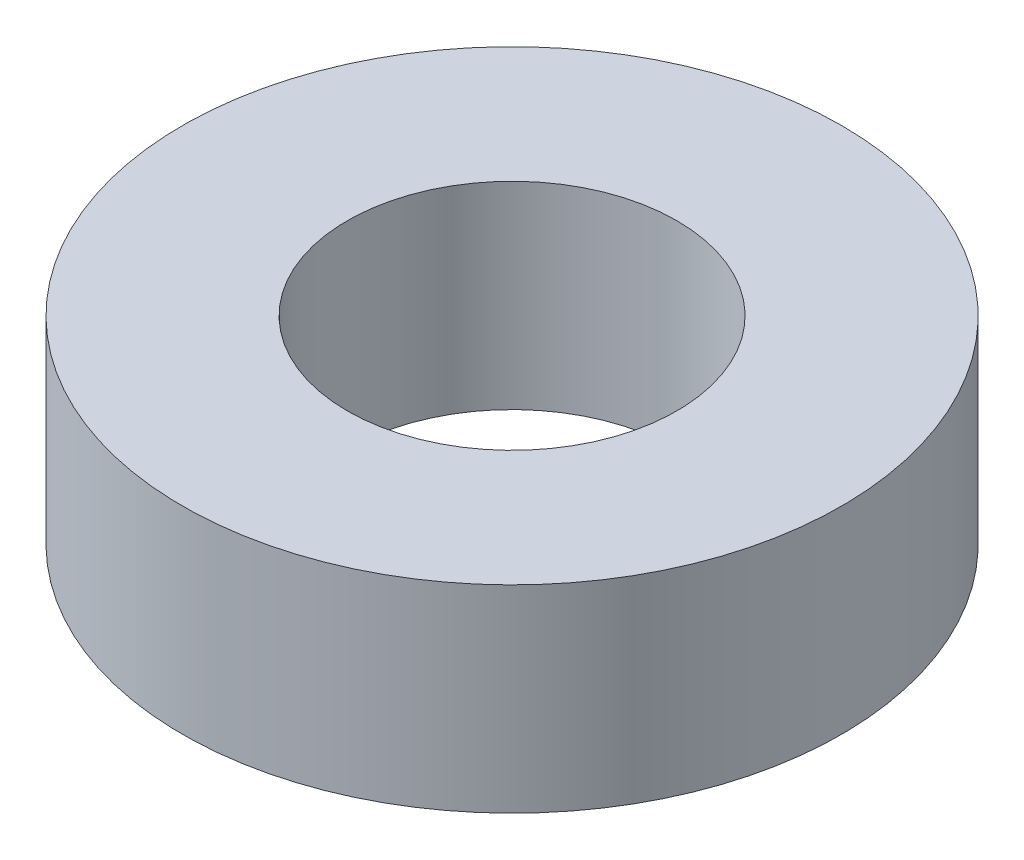
ISO-10303-21;
HEADER;
FILE_DESCRIPTION(('STEP AP214'),'2;1');
FILE_NAME('part.step','',(''),(''),'','','');
FILE_SCHEMA(('AUTOMOTIVE_DESIGN { 1 0 10303 214 1 1 1 1 }'));
ENDSEC;
DATA;
#1=APPLICATION_CONTEXT('core data for automotive mechanical design processes');
#2=APPLICATION_PROTOCOL_DEFINITION('international standard','automotive_design',2000,#1);
#3=PRODUCT_CONTEXT('',#1,'mechanical');
#4=PRODUCT('Part','Part','',(#3));
#5=PRODUCT_RELATED_PRODUCT_CATEGORY('part','',(#4));
#6=PRODUCT_DEFINITION_FORMATION('','',#4);
#7=PRODUCT_DEFINITION_CONTEXT('part definition',#1,'design');
#8=PRODUCT_DEFINITION('design','',#6,#7);
#9=PRODUCT_DEFINITION_SHAPE('','',#8);
#10=(LENGTH_UNIT() NAMED_UNIT(*) SI_UNIT(.MILLI.,.METRE.));
#11=(NAMED_UNIT(*) PLANE_ANGLE_UNIT() SI_UNIT($,.RADIAN.));
#12=(NAMED_UNIT(*) SI_UNIT($,.STERADIAN.) SOLID_ANGLE_UNIT());
#13=UNCERTAINTY_MEASURE_WITH_UNIT(LENGTH_MEASURE(1.E-05),#10,'distance_accuracy_value','');
#14=(GEOMETRIC_REPRESENTATION_CONTEXT(3) GLOBAL_UNCERTAINTY_ASSIGNED_CONTEXT((#13)) GLOBAL_UNIT_ASSIGNED_CONTEXT((#10,
#11,#12)) REPRESENTATION_CONTEXT('',''));
#15=CARTESIAN_POINT('',(0.,0.,0.));
#16=DIRECTION('',(0.,0.,1.));
#17=DIRECTION('',(1.,0.,0.));
#18=AXIS2_PLACEMENT_3D('',#15,#16,#17);
#19=CARTESIAN_POINT('',(0.,1.5,0.));
#20=DIRECTION('',(0.,1.,0.));
#21=DIRECTION('',(0.,0.,-1.));
#22=AXIS2_PLACEMENT_3D('',#19,#20,#21);
#23=PLANE('',#22);
#24=CARTESIAN_POINT('',(0.,1.5,0.));
#25=DIRECTION('',(0.,-1.,0.));
#26=DIRECTION('',(0.,0.,-1.));
#27=AXIS2_PLACEMENT_3D('',#24,#25,#26);
#28=CIRCLE('',#27,5.);
#29=CARTESIAN_POINT('',(0.,1.5,-5.));
#30=VERTEX_POINT('',#29);
#31=EDGE_CURVE('E10',#30,#30,#28,.T.);
#32=ORIENTED_EDGE('',*,*,#31,.F.);
#33=EDGE_LOOP('',(#32));
#34=FACE_BOUND('',#33,.T.);
#35=CARTESIAN_POINT('',(0.,1.5,0.));
#36=DIRECTION('',(0.,-1.,0.));
#37=DIRECTION('',(0.,0.,-1.));
#38=AXIS2_PLACEMENT_3D('',#35,#36,#37);
#39=CIRCLE('',#38,2.5);
#40=CARTESIAN_POINT('',(0.,1.5,-2.5));
#41=VERTEX_POINT('',#40);
#42=EDGE_CURVE('E43',#41,#41,#39,.T.);
#43=ORIENTED_EDGE('',*,*,#42,.T.);
#44=EDGE_LOOP('',(#43));
#45=FACE_BOUND('',#44,.T.);
#46=ADVANCED_FACE('F32',(#34,#45),#23,.T.);
#47=CARTESIAN_POINT('',(0.,-1.5,0.));
#48=DIRECTION('',(0.,1.,0.));
#49=DIRECTION('',(0.,0.,-1.));
#50=AXIS2_PLACEMENT_3D('',#47,#48,#49);
#51=PLANE('',#50);
#52=CARTESIAN_POINT('',(0.,-1.5,0.));
#53=DIRECTION('',(0.,-1.,0.));
#54=DIRECTION('',(0.,0.,-1.));
#55=AXIS2_PLACEMENT_3D('',#52,#53,#54);
#56=CIRCLE('',#55,5.);
#57=CARTESIAN_POINT('',(0.,-1.5,-5.));
#58=VERTEX_POINT('',#57);
#59=EDGE_CURVE('E36',#58,#58,#56,.T.);
#60=ORIENTED_EDGE('',*,*,#59,.T.);
#61=EDGE_LOOP('',(#60));
#62=FACE_BOUND('',#61,.T.);
#63=CARTESIAN_POINT('',(0.,-1.5,0.));
#64=DIRECTION('',(0.,-1.,0.));
#65=DIRECTION('',(0.,0.,-1.));
#66=AXIS2_PLACEMENT_3D('',#63,#64,#65);
#67=CIRCLE('',#66,2.5);
#68=CARTESIAN_POINT('',(0.,-1.5,-2.5));
#69=VERTEX_POINT('',#68);
#70=EDGE_CURVE('E45',#69,#69,#67,.T.);
#71=ORIENTED_EDGE('',*,*,#70,.F.);
#72=EDGE_LOOP('',(#71));
#73=FACE_BOUND('',#72,.T.);
#74=ADVANCED_FACE('F58',(#62,#73),#51,.F.);
#75=CARTESIAN_POINT('',(0.,1.5,0.));
#76=DIRECTION('',(0.,-1.,0.));
#77=DIRECTION('',(0.,0.,1.));
#78=AXIS2_PLACEMENT_3D('',#75,#76,#77);
#79=CYLINDRICAL_SURFACE('',#78,5.);
#80=ORIENTED_EDGE('',*,*,#31,.T.);
#81=EDGE_LOOP('',(#80));
#82=FACE_BOUND('',#81,.T.);
#83=ORIENTED_EDGE('',*,*,#59,.F.);
#84=EDGE_LOOP('',(#83));
#85=FACE_BOUND('',#84,.T.);
#86=ADVANCED_FACE('F34',(#82,#85),#79,.T.);
#87=CARTESIAN_POINT('',(0.,1.5,0.));
#88=DIRECTION('',(0.,-1.,0.));
#89=DIRECTION('',(0.,0.,1.));
#90=AXIS2_PLACEMENT_3D('',#87,#88,#89);
#91=CYLINDRICAL_SURFACE('',#90,2.5);
#92=ORIENTED_EDGE('',*,*,#42,.F.);
#93=EDGE_LOOP('',(#92));
#94=FACE_BOUND('',#93,.T.);
#95=ORIENTED_EDGE('',*,*,#70,.T.);
#96=EDGE_LOOP('',(#95));
#97=FACE_BOUND('',#96,.T.);
#98=ADVANCED_FACE('F52',(#94,#97),#91,.F.);
#99=CLOSED_SHELL('',(#46,#74,#86,#98));
#100=MANIFOLD_SOLID_BREP('B2',#99);
#101=ADVANCED_BREP_SHAPE_REPRESENTATION('',(#18,#100),#14);
#102=SHAPE_DEFINITION_REPRESENTATION(#9,#101);
ENDSEC;
END-ISO-10303-21;
